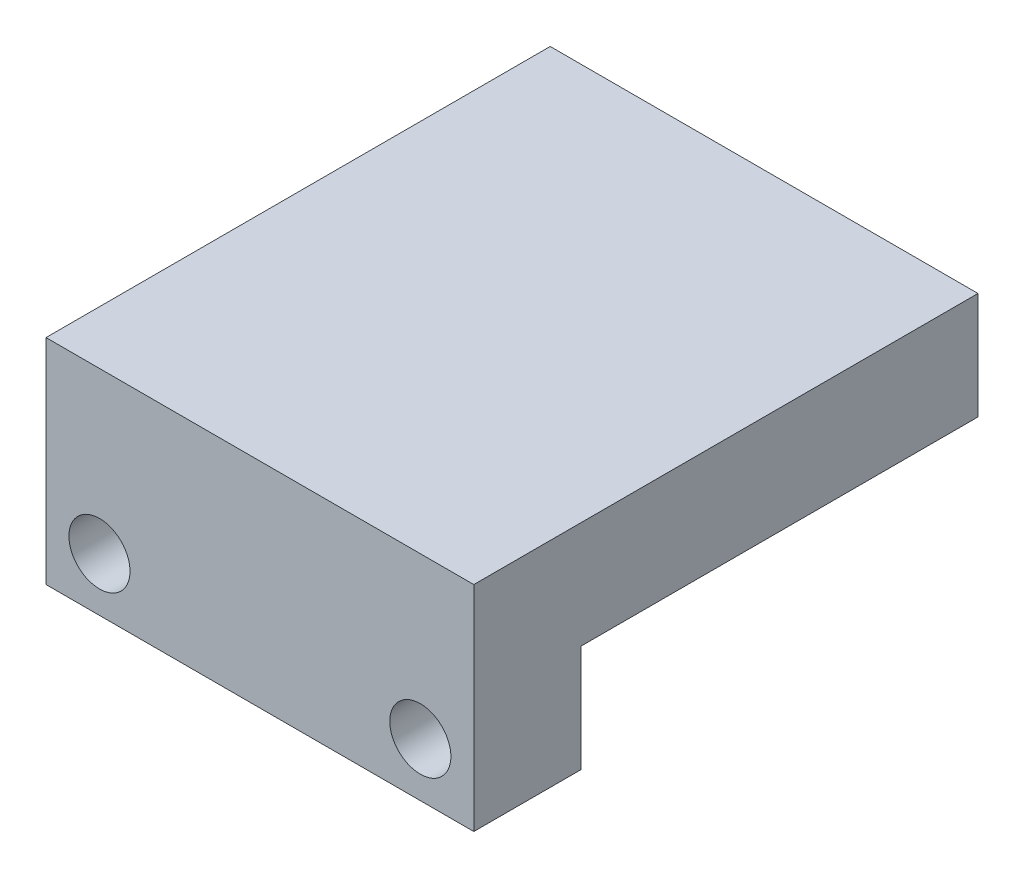
ISO-10303-21;
HEADER;
FILE_DESCRIPTION(('STEP AP214'),'2;1');
FILE_NAME('part.step','',(''),(''),'','','');
FILE_SCHEMA(('AUTOMOTIVE_DESIGN { 1 0 10303 214 1 1 1 1 }'));
ENDSEC;
DATA;
#1=APPLICATION_CONTEXT('core data for automotive mechanical design processes');
#2=APPLICATION_PROTOCOL_DEFINITION('international standard','automotive_design',2000,#1);
#3=PRODUCT_CONTEXT('',#1,'mechanical');
#4=PRODUCT('Part','Part','',(#3));
#5=PRODUCT_RELATED_PRODUCT_CATEGORY('part','',(#4));
#6=PRODUCT_DEFINITION_FORMATION('','',#4);
#7=PRODUCT_DEFINITION_CONTEXT('part definition',#1,'design');
#8=PRODUCT_DEFINITION('design','',#6,#7);
#9=PRODUCT_DEFINITION_SHAPE('','',#8);
#10=(LENGTH_UNIT() NAMED_UNIT(*) SI_UNIT(.MILLI.,.METRE.));
#11=(NAMED_UNIT(*) PLANE_ANGLE_UNIT() SI_UNIT($,.RADIAN.));
#12=(NAMED_UNIT(*) SI_UNIT($,.STERADIAN.) SOLID_ANGLE_UNIT());
#13=UNCERTAINTY_MEASURE_WITH_UNIT(LENGTH_MEASURE(1.E-05),#10,'distance_accuracy_value','');
#14=(GEOMETRIC_REPRESENTATION_CONTEXT(3) GLOBAL_UNCERTAINTY_ASSIGNED_CONTEXT((#13)) GLOBAL_UNIT_ASSIGNED_CONTEXT((#10,
#11,#12)) REPRESENTATION_CONTEXT('',''));
#15=CARTESIAN_POINT('',(0.,0.,0.));
#16=DIRECTION('',(0.,0.,1.));
#17=DIRECTION('',(1.,0.,0.));
#18=AXIS2_PLACEMENT_3D('',#15,#16,#17);
#19=CARTESIAN_POINT('',(0.,2.,19.));
#20=DIRECTION('',(0.,0.,-1.));
#21=DIRECTION('',(-1.,0.,0.));
#22=AXIS2_PLACEMENT_3D('',#19,#20,#21);
#23=PLANE('',#22);
#24=DIRECTION('',(0.,-1.,0.));
#25=VECTOR('',#24,1.);
#26=CARTESIAN_POINT('',(-14.,2.,19.));
#27=LINE('',#26,#25);
#28=CARTESIAN_POINT('',(-14.,2.,19.));
#29=VERTEX_POINT('',#28);
#30=CARTESIAN_POINT('',(-14.,-12.,19.));
#31=VERTEX_POINT('',#30);
#32=EDGE_CURVE('E145',#29,#31,#27,.T.);
#33=ORIENTED_EDGE('',*,*,#32,.T.);
#34=DIRECTION('',(1.,0.,0.));
#35=VECTOR('',#34,1.);
#36=CARTESIAN_POINT('',(0.,-12.,19.));
#37=LINE('',#36,#35);
#38=CARTESIAN_POINT('',(14.,-12.,19.));
#39=VERTEX_POINT('',#38);
#40=EDGE_CURVE('E100',#31,#39,#37,.T.);
#41=ORIENTED_EDGE('',*,*,#40,.T.);
#42=DIRECTION('',(0.,-1.,0.));
#43=VECTOR('',#42,1.);
#44=CARTESIAN_POINT('',(14.,2.,19.));
#45=LINE('',#44,#43);
#46=CARTESIAN_POINT('',(14.,2.,19.));
#47=VERTEX_POINT('',#46);
#48=EDGE_CURVE('E143',#47,#39,#45,.T.);
#49=ORIENTED_EDGE('',*,*,#48,.F.);
#50=DIRECTION('',(1.,0.,0.));
#51=VECTOR('',#50,1.);
#52=CARTESIAN_POINT('',(0.,2.,19.));
#53=LINE('',#52,#51);
#54=EDGE_CURVE('E141',#29,#47,#53,.T.);
#55=ORIENTED_EDGE('',*,*,#54,.F.);
#56=EDGE_LOOP('',(#33,#41,#49,#55));
#57=FACE_BOUND('',#56,.T.);
#58=CARTESIAN_POINT('',(-10.5,-8.50000000000003,19.));
#59=DIRECTION('',(0.,0.,-1.));
#60=DIRECTION('',(-1.,0.,0.));
#61=AXIS2_PLACEMENT_3D('',#58,#59,#60);
#62=CIRCLE('',#61,2.);
#63=CARTESIAN_POINT('',(-12.5,-8.50000000000003,19.));
#64=VERTEX_POINT('',#63);
#65=EDGE_CURVE('E125',#64,#64,#62,.F.);
#66=ORIENTED_EDGE('',*,*,#65,.F.);
#67=EDGE_LOOP('',(#66));
#68=FACE_BOUND('',#67,.T.);
#69=CARTESIAN_POINT('',(10.5,-8.5,19.));
#70=DIRECTION('',(0.,0.,-1.));
#71=DIRECTION('',(-1.,0.,0.));
#72=AXIS2_PLACEMENT_3D('',#69,#70,#71);
#73=CIRCLE('',#72,2.);
#74=CARTESIAN_POINT('',(8.50000000000001,-8.5,19.));
#75=VERTEX_POINT('',#74);
#76=EDGE_CURVE('E126',#75,#75,#73,.T.);
#77=ORIENTED_EDGE('',*,*,#76,.T.);
#78=EDGE_LOOP('',(#77));
#79=FACE_BOUND('',#78,.T.);
#80=ADVANCED_FACE('F39',(#57,#68,#79),#23,.F.);
#81=CARTESIAN_POINT('',(14.,-5.,0.));
#82=DIRECTION('',(-1.,0.,0.));
#83=DIRECTION('',(0.,0.,1.));
#84=AXIS2_PLACEMENT_3D('',#81,#82,#83);
#85=PLANE('',#84);
#86=DIRECTION('',(0.,1.,0.));
#87=VECTOR('',#86,1.);
#88=CARTESIAN_POINT('',(14.,-5.,-14.));
#89=LINE('',#88,#87);
#90=CARTESIAN_POINT('',(14.,-5.,-14.));
#91=VERTEX_POINT('',#90);
#92=CARTESIAN_POINT('',(14.,2.,-14.));
#93=VERTEX_POINT('',#92);
#94=EDGE_CURVE('E43',#91,#93,#89,.T.);
#95=ORIENTED_EDGE('',*,*,#94,.T.);
#96=DIRECTION('',(0.,0.,1.));
#97=VECTOR('',#96,1.);
#98=CARTESIAN_POINT('',(14.,2.,0.));
#99=LINE('',#98,#97);
#100=EDGE_CURVE('E133',#93,#47,#99,.T.);
#101=ORIENTED_EDGE('',*,*,#100,.T.);
#102=ORIENTED_EDGE('',*,*,#48,.T.);
#103=DIRECTION('',(0.,0.,1.));
#104=VECTOR('',#103,1.);
#105=CARTESIAN_POINT('',(14.,-12.,0.));
#106=LINE('',#105,#104);
#107=CARTESIAN_POINT('',(14.,-12.,12.));
#108=VERTEX_POINT('',#107);
#109=EDGE_CURVE('E102',#108,#39,#106,.T.);
#110=ORIENTED_EDGE('',*,*,#109,.F.);
#111=DIRECTION('',(0.,-1.,0.));
#112=VECTOR('',#111,1.);
#113=CARTESIAN_POINT('',(14.,-5.,12.));
#114=LINE('',#113,#112);
#115=CARTESIAN_POINT('',(14.,-5.,12.));
#116=VERTEX_POINT('',#115);
#117=EDGE_CURVE('E115',#116,#108,#114,.T.);
#118=ORIENTED_EDGE('',*,*,#117,.F.);
#119=DIRECTION('',(0.,0.,1.));
#120=VECTOR('',#119,1.);
#121=CARTESIAN_POINT('',(14.,-5.,0.));
#122=LINE('',#121,#120);
#123=EDGE_CURVE('E151',#91,#116,#122,.T.);
#124=ORIENTED_EDGE('',*,*,#123,.F.);
#125=EDGE_LOOP('',(#95,#101,#102,#110,#118,#124));
#126=FACE_BOUND('',#125,.T.);
#127=ADVANCED_FACE('F174',(#126),#85,.F.);
#128=CARTESIAN_POINT('',(-14.,-5.,0.));
#129=DIRECTION('',(-1.,0.,0.));
#130=DIRECTION('',(0.,0.,1.));
#131=AXIS2_PLACEMENT_3D('',#128,#129,#130);
#132=PLANE('',#131);
#133=DIRECTION('',(0.,0.,1.));
#134=VECTOR('',#133,1.);
#135=CARTESIAN_POINT('',(-14.,-5.,0.));
#136=LINE('',#135,#134);
#137=CARTESIAN_POINT('',(-14.,-5.,-14.));
#138=VERTEX_POINT('',#137);
#139=CARTESIAN_POINT('',(-14.,-5.,12.));
#140=VERTEX_POINT('',#139);
#141=EDGE_CURVE('E106',#138,#140,#136,.T.);
#142=ORIENTED_EDGE('',*,*,#141,.T.);
#143=DIRECTION('',(0.,1.,0.));
#144=VECTOR('',#143,1.);
#145=CARTESIAN_POINT('',(-14.,-12.,12.));
#146=LINE('',#145,#144);
#147=CARTESIAN_POINT('',(-14.,-12.,12.));
#148=VERTEX_POINT('',#147);
#149=EDGE_CURVE('E104',#148,#140,#146,.T.);
#150=ORIENTED_EDGE('',*,*,#149,.F.);
#151=DIRECTION('',(0.,0.,1.));
#152=VECTOR('',#151,1.);
#153=CARTESIAN_POINT('',(-14.,-12.,0.));
#154=LINE('',#153,#152);
#155=EDGE_CURVE('E93',#148,#31,#154,.T.);
#156=ORIENTED_EDGE('',*,*,#155,.T.);
#157=ORIENTED_EDGE('',*,*,#32,.F.);
#158=DIRECTION('',(0.,0.,1.));
#159=VECTOR('',#158,1.);
#160=CARTESIAN_POINT('',(-14.,2.,0.));
#161=LINE('',#160,#159);
#162=CARTESIAN_POINT('',(-14.,2.,-14.));
#163=VERTEX_POINT('',#162);
#164=EDGE_CURVE('E139',#163,#29,#161,.T.);
#165=ORIENTED_EDGE('',*,*,#164,.F.);
#166=DIRECTION('',(0.,1.,0.));
#167=VECTOR('',#166,1.);
#168=CARTESIAN_POINT('',(-14.,-5.,-14.));
#169=LINE('',#168,#167);
#170=EDGE_CURVE('E11',#138,#163,#169,.T.);
#171=ORIENTED_EDGE('',*,*,#170,.F.);
#172=EDGE_LOOP('',(#142,#150,#156,#157,#165,#171));
#173=FACE_BOUND('',#172,.T.);
#174=ADVANCED_FACE('F105',(#173),#132,.T.);
#175=CARTESIAN_POINT('',(0.,-5.,0.));
#176=DIRECTION('',(0.,1.,0.));
#177=DIRECTION('',(0.,0.,1.));
#178=AXIS2_PLACEMENT_3D('',#175,#176,#177);
#179=CYLINDRICAL_SURFACE('',#178,9.);
#180=CARTESIAN_POINT('',(0.,-5.,0.));
#181=DIRECTION('',(0.,1.,0.));
#182=DIRECTION('',(0.,0.,1.));
#183=AXIS2_PLACEMENT_3D('',#180,#181,#182);
#184=CIRCLE('',#183,9.);
#185=CARTESIAN_POINT('',(0.,-5.,9.));
#186=VERTEX_POINT('',#185);
#187=EDGE_CURVE('E148',#186,#186,#184,.T.);
#188=ORIENTED_EDGE('',*,*,#187,.F.);
#189=EDGE_LOOP('',(#188));
#190=FACE_BOUND('',#189,.T.);
#191=CARTESIAN_POINT('',(0.,0.,0.));
#192=DIRECTION('',(0.,1.,0.));
#193=DIRECTION('',(0.,0.,1.));
#194=AXIS2_PLACEMENT_3D('',#191,#192,#193);
#195=CIRCLE('',#194,9.);
#196=CARTESIAN_POINT('',(0.,0.,9.));
#197=VERTEX_POINT('',#196);
#198=EDGE_CURVE('E147',#197,#197,#195,.T.);
#199=ORIENTED_EDGE('',*,*,#198,.T.);
#200=EDGE_LOOP('',(#199));
#201=FACE_BOUND('',#200,.T.);
#202=ADVANCED_FACE('F41',(#190,#201),#179,.F.);
#203=CARTESIAN_POINT('',(0.,-5.,-14.));
#204=DIRECTION('',(0.,0.,1.));
#205=DIRECTION('',(1.,0.,0.));
#206=AXIS2_PLACEMENT_3D('',#203,#204,#205);
#207=PLANE('',#206);
#208=ORIENTED_EDGE('',*,*,#170,.T.);
#209=DIRECTION('',(1.,0.,0.));
#210=VECTOR('',#209,1.);
#211=CARTESIAN_POINT('',(0.,2.,-14.));
#212=LINE('',#211,#210);
#213=EDGE_CURVE('E136',#163,#93,#212,.T.);
#214=ORIENTED_EDGE('',*,*,#213,.T.);
#215=ORIENTED_EDGE('',*,*,#94,.F.);
#216=DIRECTION('',(1.,0.,0.));
#217=VECTOR('',#216,1.);
#218=CARTESIAN_POINT('',(0.,-5.,-14.));
#219=LINE('',#218,#217);
#220=EDGE_CURVE('E59',#138,#91,#219,.T.);
#221=ORIENTED_EDGE('',*,*,#220,.F.);
#222=EDGE_LOOP('',(#208,#214,#215,#221));
#223=FACE_BOUND('',#222,.T.);
#224=ADVANCED_FACE('F184',(#223),#207,.F.);
#225=CARTESIAN_POINT('',(0.,-5.,0.));
#226=DIRECTION('',(0.,1.,0.));
#227=DIRECTION('',(0.,0.,1.));
#228=AXIS2_PLACEMENT_3D('',#225,#226,#227);
#229=PLANE('',#228);
#230=ORIENTED_EDGE('',*,*,#187,.T.);
#231=EDGE_LOOP('',(#230));
#232=FACE_BOUND('',#231,.T.);
#233=ORIENTED_EDGE('',*,*,#123,.T.);
#234=DIRECTION('',(1.,0.,0.));
#235=VECTOR('',#234,1.);
#236=CARTESIAN_POINT('',(-14.,-5.,12.));
#237=LINE('',#236,#235);
#238=EDGE_CURVE('E109',#140,#116,#237,.T.);
#239=ORIENTED_EDGE('',*,*,#238,.F.);
#240=ORIENTED_EDGE('',*,*,#141,.F.);
#241=ORIENTED_EDGE('',*,*,#220,.T.);
#242=EDGE_LOOP('',(#233,#239,#240,#241));
#243=FACE_BOUND('',#242,.T.);
#244=ADVANCED_FACE('F170',(#232,#243),#229,.F.);
#245=CARTESIAN_POINT('',(0.,2.,0.));
#246=DIRECTION('',(0.,1.,0.));
#247=DIRECTION('',(0.,0.,1.));
#248=AXIS2_PLACEMENT_3D('',#245,#246,#247);
#249=PLANE('',#248);
#250=ORIENTED_EDGE('',*,*,#100,.F.);
#251=ORIENTED_EDGE('',*,*,#213,.F.);
#252=ORIENTED_EDGE('',*,*,#164,.T.);
#253=ORIENTED_EDGE('',*,*,#54,.T.);
#254=EDGE_LOOP('',(#250,#251,#252,#253));
#255=FACE_BOUND('',#254,.T.);
#256=ADVANCED_FACE('F161',(#255),#249,.T.);
#257=CARTESIAN_POINT('',(0.,0.,0.));
#258=DIRECTION('',(0.,1.,0.));
#259=DIRECTION('',(0.,0.,1.));
#260=AXIS2_PLACEMENT_3D('',#257,#258,#259);
#261=PLANE('',#260);
#262=ORIENTED_EDGE('',*,*,#198,.F.);
#263=EDGE_LOOP('',(#262));
#264=FACE_BOUND('',#263,.T.);
#265=ADVANCED_FACE('F159',(#264),#261,.F.);
#266=CARTESIAN_POINT('',(0.,-12.,0.));
#267=DIRECTION('',(0.,1.,0.));
#268=DIRECTION('',(0.,0.,1.));
#269=AXIS2_PLACEMENT_3D('',#266,#267,#268);
#270=PLANE('',#269);
#271=ORIENTED_EDGE('',*,*,#109,.T.);
#272=ORIENTED_EDGE('',*,*,#40,.F.);
#273=ORIENTED_EDGE('',*,*,#155,.F.);
#274=DIRECTION('',(-1.,0.,0.));
#275=VECTOR('',#274,1.);
#276=CARTESIAN_POINT('',(14.,-12.,12.));
#277=LINE('',#276,#275);
#278=EDGE_CURVE('E98',#108,#148,#277,.T.);
#279=ORIENTED_EDGE('',*,*,#278,.F.);
#280=EDGE_LOOP('',(#271,#272,#273,#279));
#281=FACE_BOUND('',#280,.T.);
#282=ADVANCED_FACE('F96',(#281),#270,.F.);
#283=CARTESIAN_POINT('',(-10.5,-8.50000000000003,19.));
#284=DIRECTION('',(0.,0.,-1.));
#285=DIRECTION('',(-1.,0.,0.));
#286=AXIS2_PLACEMENT_3D('',#283,#284,#285);
#287=CYLINDRICAL_SURFACE('',#286,2.);
#288=ORIENTED_EDGE('',*,*,#65,.T.);
#289=EDGE_LOOP('',(#288));
#290=FACE_BOUND('',#289,.T.);
#291=CARTESIAN_POINT('',(-10.5,-8.50000000000003,12.));
#292=DIRECTION('',(0.,0.,-1.));
#293=DIRECTION('',(1.,0.,0.));
#294=AXIS2_PLACEMENT_3D('',#291,#292,#293);
#295=CIRCLE('',#294,2.);
#296=CARTESIAN_POINT('',(-8.50000000000001,-8.50000000000003,12.));
#297=VERTEX_POINT('',#296);
#298=EDGE_CURVE('E119',#297,#297,#295,.T.);
#299=ORIENTED_EDGE('',*,*,#298,.T.);
#300=EDGE_LOOP('',(#299));
#301=FACE_BOUND('',#300,.T.);
#302=ADVANCED_FACE('F168',(#290,#301),#287,.F.);
#303=CARTESIAN_POINT('',(10.5,-8.5,19.));
#304=DIRECTION('',(0.,0.,-1.));
#305=DIRECTION('',(-1.,0.,0.));
#306=AXIS2_PLACEMENT_3D('',#303,#304,#305);
#307=CYLINDRICAL_SURFACE('',#306,2.);
#308=ORIENTED_EDGE('',*,*,#76,.F.);
#309=EDGE_LOOP('',(#308));
#310=FACE_BOUND('',#309,.T.);
#311=CARTESIAN_POINT('',(10.5,-8.5,12.));
#312=DIRECTION('',(0.,0.,-1.));
#313=DIRECTION('',(-1.,0.,0.));
#314=AXIS2_PLACEMENT_3D('',#311,#312,#313);
#315=CIRCLE('',#314,2.);
#316=CARTESIAN_POINT('',(8.50000000000001,-8.5,12.));
#317=VERTEX_POINT('',#316);
#318=EDGE_CURVE('E116',#317,#317,#315,.T.);
#319=ORIENTED_EDGE('',*,*,#318,.T.);
#320=EDGE_LOOP('',(#319));
#321=FACE_BOUND('',#320,.T.);
#322=ADVANCED_FACE('F274',(#310,#321),#307,.F.);
#323=CARTESIAN_POINT('',(0.,0.,12.));
#324=DIRECTION('',(0.,0.,-1.));
#325=DIRECTION('',(-1.,0.,0.));
#326=AXIS2_PLACEMENT_3D('',#323,#324,#325);
#327=PLANE('',#326);
#328=ORIENTED_EDGE('',*,*,#318,.F.);
#329=EDGE_LOOP('',(#328));
#330=FACE_BOUND('',#329,.T.);
#331=ORIENTED_EDGE('',*,*,#278,.T.);
#332=ORIENTED_EDGE('',*,*,#149,.T.);
#333=ORIENTED_EDGE('',*,*,#238,.T.);
#334=ORIENTED_EDGE('',*,*,#117,.T.);
#335=EDGE_LOOP('',(#331,#332,#333,#334));
#336=FACE_BOUND('',#335,.T.);
#337=ORIENTED_EDGE('',*,*,#298,.F.);
#338=EDGE_LOOP('',(#337));
#339=FACE_BOUND('',#338,.T.);
#340=ADVANCED_FACE('F112',(#330,#336,#339),#327,.T.);
#341=CLOSED_SHELL('',(#80,#127,#174,#202,#224,#244,#256,#265,#282,#302,#322,#340));
#342=MANIFOLD_SOLID_BREP('B2',#341);
#343=ADVANCED_BREP_SHAPE_REPRESENTATION('',(#18,#342),#14);
#344=SHAPE_DEFINITION_REPRESENTATION(#9,#343);
ENDSEC;
END-ISO-10303-21;
